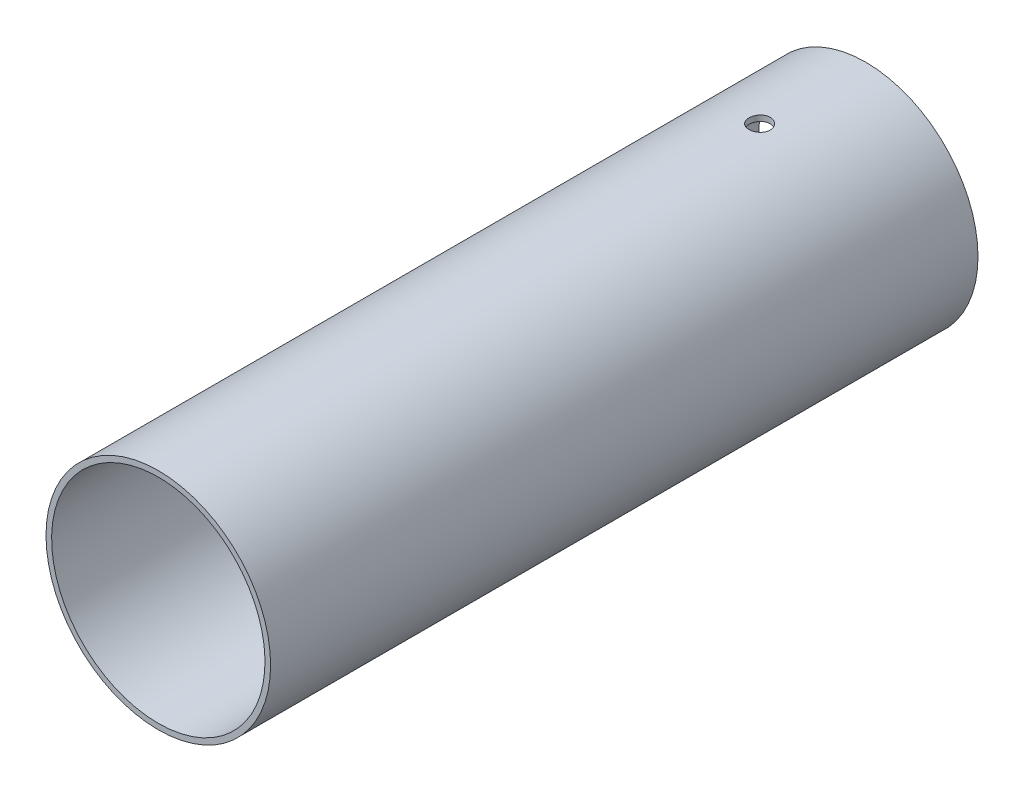
ISO-10303-21;
HEADER;
FILE_DESCRIPTION(('STEP AP214'),'2;1');
FILE_NAME('part.step','',(''),(''),'','','');
FILE_SCHEMA(('AUTOMOTIVE_DESIGN { 1 0 10303 214 1 1 1 1 }'));
ENDSEC;
DATA;
#1=APPLICATION_CONTEXT('core data for automotive mechanical design processes');
#2=APPLICATION_PROTOCOL_DEFINITION('international standard','automotive_design',2000,#1);
#3=PRODUCT_CONTEXT('',#1,'mechanical');
#4=PRODUCT('Part','Part','',(#3));
#5=PRODUCT_RELATED_PRODUCT_CATEGORY('part','',(#4));
#6=PRODUCT_DEFINITION_FORMATION('','',#4);
#7=PRODUCT_DEFINITION_CONTEXT('part definition',#1,'design');
#8=PRODUCT_DEFINITION('design','',#6,#7);
#9=PRODUCT_DEFINITION_SHAPE('','',#8);
#10=(LENGTH_UNIT() NAMED_UNIT(*) SI_UNIT(.MILLI.,.METRE.));
#11=(NAMED_UNIT(*) PLANE_ANGLE_UNIT() SI_UNIT($,.RADIAN.));
#12=(NAMED_UNIT(*) SI_UNIT($,.STERADIAN.) SOLID_ANGLE_UNIT());
#13=UNCERTAINTY_MEASURE_WITH_UNIT(LENGTH_MEASURE(1.E-05),#10,'distance_accuracy_value','');
#14=(GEOMETRIC_REPRESENTATION_CONTEXT(3) GLOBAL_UNCERTAINTY_ASSIGNED_CONTEXT((#13)) GLOBAL_UNIT_ASSIGNED_CONTEXT((#10,
#11,#12)) REPRESENTATION_CONTEXT('',''));
#15=CARTESIAN_POINT('',(0.,0.,0.));
#16=DIRECTION('',(0.,0.,1.));
#17=DIRECTION('',(1.,0.,0.));
#18=AXIS2_PLACEMENT_3D('',#15,#16,#17);
#19=CARTESIAN_POINT('',(0.,0.,0.));
#20=DIRECTION('',(0.,0.,1.));
#21=DIRECTION('',(0.,-1.,0.));
#22=AXIS2_PLACEMENT_3D('',#19,#20,#21);
#23=CYLINDRICAL_SURFACE('',#22,63.5);
#24=CARTESIAN_POINT('',(0.,63.5,-346.));
#25=CARTESIAN_POINT('',(0.16816877938534,63.5000004126939,-346.000001603211));
#26=CARTESIAN_POINT('',(0.3363129018746,63.4993305953231,-345.992927121788));
#27=CARTESIAN_POINT('',(0.671456509395669,63.4966709197132,-345.964681368669));
#28=CARTESIAN_POINT('',(0.838455707132574,63.4946807415839,-345.943506680843));
#29=CARTESIAN_POINT('',(1.17019658857256,63.4894336822889,-345.887187127174));
#30=CARTESIAN_POINT('',(1.3349363384223,63.4861757785493,-345.852030983092));
#31=CARTESIAN_POINT('',(1.6609129538474,63.4784842139934,-345.767989973041));
#32=CARTESIAN_POINT('',(1.82214851437531,63.4740501229874,-345.719100083575));
#33=CARTESIAN_POINT('',(2.13975680891662,63.4641368273001,-345.608004852568));
#34=CARTESIAN_POINT('',(2.29613407222356,63.4586586322303,-345.545812367117));
#35=CARTESIAN_POINT('',(2.60314271096063,63.4468065259248,-345.408505822782));
#36=CARTESIAN_POINT('',(2.75377194578975,63.4404322850563,-345.333387006334));
#37=CARTESIAN_POINT('',(3.04808004931412,63.4269729592952,-345.170827073554));
#38=CARTESIAN_POINT('',(3.19176287983415,63.4198882868525,-345.083393095151));
#39=CARTESIAN_POINT('',(3.4713178437417,63.4052013258802,-344.896754963624));
#40=CARTESIAN_POINT('',(3.60718706492454,63.3975988466357,-344.797546463696));
#41=CARTESIAN_POINT('',(3.87043717522845,63.3820727724827,-344.587821717664));
#42=CARTESIAN_POINT('',(3.99779596969299,63.3741484215397,-344.477277793185));
#43=CARTESIAN_POINT('',(4.24280286662339,63.3582173372738,-344.245825486201));
#44=CARTESIAN_POINT('',(4.36044736266011,63.3502105745851,-344.124913288136));
#45=CARTESIAN_POINT('',(4.58510909129194,63.334346573671,-343.873650316176));
#46=CARTESIAN_POINT('',(4.69212974263992,63.3264892880062,-343.743302602132));
#47=CARTESIAN_POINT('',(4.89486908416142,63.3111411916476,-343.473999767805));
#48=CARTESIAN_POINT('',(4.99058358905657,63.3036505172622,-343.335041488925));
#49=CARTESIAN_POINT('',(5.17012218566508,63.2892405082324,-343.049318950477));
#50=CARTESIAN_POINT('',(5.25392793478788,63.2823220616731,-342.902543117761));
#51=CARTESIAN_POINT('',(5.40890339727819,63.2692643684776,-342.602366326684));
#52=CARTESIAN_POINT('',(5.48006842034212,63.2631254113086,-342.448962935324));
#53=CARTESIAN_POINT('',(5.60918567408223,63.2518082675253,-342.136715165658));
#54=CARTESIAN_POINT('',(5.66714300978827,63.2466297098424,-341.977872916976));
#55=CARTESIAN_POINT('',(5.76947580896158,63.2373761959171,-341.655823552431));
#56=CARTESIAN_POINT('',(5.81384626935816,63.2333016462648,-341.492614852715));
#57=CARTESIAN_POINT('',(5.92575833607297,63.2229492885869,-340.9992862261));
#58=CARTESIAN_POINT('',(5.97263291540728,63.2184945076254,-340.664172602972));
#59=CARTESIAN_POINT('',(6.0094688508252,63.2150027843618,-339.990989404346));
#60=CARTESIAN_POINT('',(5.99943155252146,63.2159657139645,-339.652919898925));
#61=CARTESIAN_POINT('',(5.92294109958071,63.2231778709504,-338.984350498691));
#62=CARTESIAN_POINT('',(5.85667041985713,63.2294099997729,-338.653829667068));
#63=CARTESIAN_POINT('',(5.66985832289782,63.2464340784901,-338.008636041995));
#64=CARTESIAN_POINT('',(5.54931624344951,63.2572260840238,-337.693963441976));
#65=CARTESIAN_POINT('',(5.25718591161587,63.2821729618367,-337.088804395211));
#66=CARTESIAN_POINT('',(5.08551636144824,63.29633318264,-336.798357418302));
#67=CARTESIAN_POINT('',(4.69606121832889,63.3264165116538,-336.250330471652));
#68=CARTESIAN_POINT('',(4.47827442125954,63.342339665889,-335.992751360369));
#69=CARTESIAN_POINT('',(4.00174637937747,63.3742308646919,-335.516709850361));
#70=CARTESIAN_POINT('',(3.74284744420715,63.3901988395361,-335.298405266664));
#71=CARTESIAN_POINT('',(3.19199267919488,63.4203211992771,-334.908332127705));
#72=CARTESIAN_POINT('',(2.9000368180469,63.4344755824563,-334.736563616516));
#73=CARTESIAN_POINT('',(2.29124881114212,63.4593798774746,-334.444445972292));
#74=CARTESIAN_POINT('',(1.97441297252129,63.4701292827262,-334.324104489566));
#75=CARTESIAN_POINT('',(1.32490879350666,63.487007089763,-334.138370824237));
#76=CARTESIAN_POINT('',(0.992240875954015,63.4931356148885,-334.072977174964));
#77=CARTESIAN_POINT('',(0.321882883283421,63.5000653077647,-333.999194841242));
#78=CARTESIAN_POINT('',(-0.0157830130025458,63.5008868340858,-333.990588308812));
#79=CARTESIAN_POINT('',(-0.687752568814015,63.4971644804344,-334.030052873406));
#80=CARTESIAN_POINT('',(-1.02205626876792,63.4926206650548,-334.078123288099));
#81=CARTESIAN_POINT('',(-1.67718567829447,63.4786914216867,-334.229396509811));
#82=CARTESIAN_POINT('',(-1.9980350634415,63.4693149207791,-334.332497674846));
#83=CARTESIAN_POINT('',(-2.61788313692959,63.4467727087861,-334.590801590381));
#84=CARTESIAN_POINT('',(-2.91688138528954,63.4336069214284,-334.746005389636));
#85=CARTESIAN_POINT('',(-3.4855269749764,63.4049091871607,-335.104651369947));
#86=CARTESIAN_POINT('',(-3.75508342241363,63.389370249236,-335.30823709742));
#87=CARTESIAN_POINT('',(-4.25627439222475,63.3576934092042,-335.757662725958));
#88=CARTESIAN_POINT('',(-4.48790806598098,63.3415554937034,-336.003503572336));
#89=CARTESIAN_POINT('',(-4.90743191672865,63.3104385209709,-336.531405148936));
#90=CARTESIAN_POINT('',(-5.09517940473717,63.2954633467674,-336.813579524182));
#91=CARTESIAN_POINT('',(-5.42061968118008,63.2684255382998,-337.405592716286));
#92=CARTESIAN_POINT('',(-5.5583130901715,63.256362867928,-337.715431190112));
#93=CARTESIAN_POINT('',(-5.77950266876418,63.2365378563916,-338.353419629339));
#94=CARTESIAN_POINT('',(-5.86308458759428,63.2287687142465,-338.681539723546));
#95=CARTESIAN_POINT('',(-5.97393327743224,63.2183941968479,-339.347417894363));
#96=CARTESIAN_POINT('',(-6.00120147539335,63.2157886907513,-339.685175726539));
#97=CARTESIAN_POINT('',(-5.99933789125506,63.2159613315692,-340.190644544932));
#98=CARTESIAN_POINT('',(-5.9916306722798,63.2166950591828,-340.35869886318));
#99=CARTESIAN_POINT('',(-5.96214662336013,63.2194833405739,-340.693540845157));
#100=CARTESIAN_POINT('',(-5.94037501273101,63.2215374043714,-340.860328955556));
#101=CARTESIAN_POINT('',(-5.88290388443798,63.2269108908934,-341.191518050221));
#102=CARTESIAN_POINT('',(-5.84719925515438,63.2302307780014,-341.355918135404));
#103=CARTESIAN_POINT('',(-5.76214061422804,63.2380388701594,-341.681058618635));
#104=CARTESIAN_POINT('',(-5.71279159913214,63.242526647495,-341.841800333094));
#105=CARTESIAN_POINT('',(-5.60077982424999,63.2525448045042,-342.158587354456));
#106=CARTESIAN_POINT('',(-5.53811368200472,63.2580754490187,-342.31463145668));
#107=CARTESIAN_POINT('',(-5.39995025688859,63.270019286002,-342.620827718784));
#108=CARTESIAN_POINT('',(-5.3244576679958,63.2764321554481,-342.770982009448));
#109=CARTESIAN_POINT('',(-5.16113388655246,63.2899629497557,-343.064458826923));
#110=CARTESIAN_POINT('',(-5.07329836375277,63.2970811217978,-343.207778932373));
#111=CARTESIAN_POINT('',(-4.88596429987072,63.3118170141674,-343.486478845793));
#112=CARTESIAN_POINT('',(-4.78647000669393,63.3194345521066,-343.621861518982));
#113=CARTESIAN_POINT('',(-4.57605536691765,63.3349894479471,-343.884343854705));
#114=CARTESIAN_POINT('',(-4.46508931503468,63.3429280019251,-344.011406810493));
#115=CARTESIAN_POINT('',(-4.23290086227372,63.3588674347698,-344.255694669415));
#116=CARTESIAN_POINT('',(-4.11168222346607,63.3668682898058,-344.372923150016));
#117=CARTESIAN_POINT('',(-3.85972818441674,63.3827140216052,-344.596838057474));
#118=CARTESIAN_POINT('',(-3.728987031406,63.3905588003748,-344.703518018441));
#119=CARTESIAN_POINT('',(-3.45902221687687,63.4058627700035,-344.905463355791));
#120=CARTESIAN_POINT('',(-3.31980170489012,63.4133221021509,-345.000732931857));
#121=CARTESIAN_POINT('',(-3.03343172108278,63.4276666402736,-345.179464769208));
#122=CARTESIAN_POINT('',(-2.88626213823651,63.4345502658618,-345.262894940277));
#123=CARTESIAN_POINT('',(-2.585433638415,63.4475231146313,-345.417018230287));
#124=CARTESIAN_POINT('',(-2.43177712249504,63.4536126283888,-345.487716011811));
#125=CARTESIAN_POINT('',(-2.11914115103201,63.4648223724199,-345.615848411077));
#126=CARTESIAN_POINT('',(-1.96016621953473,63.4699434030297,-345.6732939889));
#127=CARTESIAN_POINT('',(-1.63796115174903,63.4790758110425,-345.774565174168));
#128=CARTESIAN_POINT('',(-1.47473207934228,63.4830874630213,-345.818394152111));
#129=CARTESIAN_POINT('',(-1.09518205821057,63.4909177597106,-345.903301323296));
#130=CARTESIAN_POINT('',(-0.877749559955827,63.4943102252457,-345.939528923201));
#131=CARTESIAN_POINT('',(-0.440197292087434,63.4988510713265,-345.98787716929));
#132=CARTESIAN_POINT('',(-0.220077532113596,63.4999994599198,-345.999997901925));
#133=CARTESIAN_POINT('',(0.,63.5,-346.));
#134=B_SPLINE_CURVE_WITH_KNOTS('',3,(#24,#25,#26,#27,#28,#29,#30,#31,#32,#33,#34,#35,#36,#37,
#38,#39,#40,#41,#42,#43,#44,#45,#46,#47,#48,#49,#50,#51,#52,#53,#54,#55,#56,#57,#58,#59,#60,#61,
#62,#63,#64,#65,#66,#67,#68,#69,#70,#71,#72,#73,#74,#75,#76,#77,#78,#79,#80,#81,#82,#83,#84,#85,
#86,#87,#88,#89,#90,#91,#92,#93,#94,#95,#96,#97,#98,#99,#100,#101,#102,#103,#104,#105,#106,#107,
#108,#109,#110,#111,#112,#113,#114,#115,#116,#117,#118,#119,#120,#121,#122,#123,#124,#125,#126,
#127,#128,#129,#130,#131,#132,#133),.UNSPECIFIED.,.T.,.F.,(4,2,2,2,2,2,2,2,2,2,2,2,2,2,2,2,2,2,
2,2,2,2,2,2,2,2,2,2,2,2,2,2,2,2,2,2,2,2,2,2,2,2,2,2,2,2,2,2,2,2,2,2,2,2,4),(0.,0.50431390906249,
1.00875004531315,1.51359391649456,2.01862268925859,2.52316557232599,3.02789455217056,
3.53233218330064,4.03695662051942,4.54284397526403,5.04891830389315,5.55482924627213,
6.06092688235292,6.56779578201082,7.07485236276459,7.58171262254062,8.08875929874118,
9.09871364456571,10.1086441113382,11.1153098745687,12.1219879213371,13.130275311553,
14.1385890313189,15.150868072441,16.1631480722339,17.175578606889,18.1879821168355,
19.1964995528303,20.2050048474726,21.2116538426255,22.2183231014642,23.2280172221321,
24.2377339341636,25.2506892825623,26.2636320721846,27.2749657200286,28.286273741018,
28.7904808884829,29.29450103138,29.7987062587274,30.3027270911188,30.8068760946836,
31.3108409952607,31.8149831444009,32.3189421757606,32.8249926704866,33.3308582746991,
33.8370320600787,34.3430189679643,34.8503521572878,35.3574991824358,35.8642252617393,
36.3708258117245,37.0308089485878,37.6907897186374),.UNSPECIFIED.);
#135=CARTESIAN_POINT('',(0.,63.5,-346.));
#136=VERTEX_POINT('',#135);
#137=EDGE_CURVE('E67',#136,#136,#134,.T.);
#138=ORIENTED_EDGE('',*,*,#137,.T.);
#139=EDGE_LOOP('',(#138));
#140=FACE_BOUND('',#139,.T.);
#141=CARTESIAN_POINT('',(0.,0.,0.));
#142=DIRECTION('',(0.,0.,1.));
#143=DIRECTION('',(0.,-1.,0.));
#144=AXIS2_PLACEMENT_3D('',#141,#142,#143);
#145=CIRCLE('',#144,63.5);
#146=CARTESIAN_POINT('',(0.,-63.5,0.));
#147=VERTEX_POINT('',#146);
#148=EDGE_CURVE('E10',#147,#147,#145,.T.);
#149=ORIENTED_EDGE('',*,*,#148,.F.);
#150=EDGE_LOOP('',(#149));
#151=FACE_BOUND('',#150,.T.);
#152=CARTESIAN_POINT('',(0.,0.,-400.));
#153=DIRECTION('',(0.,0.,1.));
#154=DIRECTION('',(0.,-1.,0.));
#155=AXIS2_PLACEMENT_3D('',#152,#153,#154);
#156=CIRCLE('',#155,63.5);
#157=CARTESIAN_POINT('',(0.,-63.4999999999999,-400.));
#158=VERTEX_POINT('',#157);
#159=EDGE_CURVE('E63',#158,#158,#156,.T.);
#160=ORIENTED_EDGE('',*,*,#159,.T.);
#161=EDGE_LOOP('',(#160));
#162=FACE_BOUND('',#161,.T.);
#163=ADVANCED_FACE('F43',(#140,#151,#162),#23,.T.);
#164=CARTESIAN_POINT('',(0.,0.,0.));
#165=DIRECTION('',(0.,0.,-1.));
#166=DIRECTION('',(0.,1.,0.));
#167=AXIS2_PLACEMENT_3D('',#164,#165,#166);
#168=PLANE('',#167);
#169=CARTESIAN_POINT('',(0.,0.,0.));
#170=DIRECTION('',(0.,0.,1.));
#171=DIRECTION('',(0.,-1.,0.));
#172=AXIS2_PLACEMENT_3D('',#169,#170,#171);
#173=CIRCLE('',#172,60.325);
#174=CARTESIAN_POINT('',(0.,-60.325,0.));
#175=VERTEX_POINT('',#174);
#176=EDGE_CURVE('E57',#175,#175,#173,.T.);
#177=ORIENTED_EDGE('',*,*,#176,.F.);
#178=EDGE_LOOP('',(#177));
#179=FACE_BOUND('',#178,.T.);
#180=ORIENTED_EDGE('',*,*,#148,.T.);
#181=EDGE_LOOP('',(#180));
#182=FACE_BOUND('',#181,.T.);
#183=ADVANCED_FACE('F83',(#179,#182),#168,.F.);
#184=CARTESIAN_POINT('',(0.,0.,0.));
#185=DIRECTION('',(0.,0.,1.));
#186=DIRECTION('',(0.,-1.,0.));
#187=AXIS2_PLACEMENT_3D('',#184,#185,#186);
#188=CYLINDRICAL_SURFACE('',#187,60.325);
#189=CARTESIAN_POINT('',(0.,60.325,-346.));
#190=CARTESIAN_POINT('',(-0.168125385819185,60.3250004455944,-346.000001648256));
#191=CARTESIAN_POINT('',(-0.336225593780459,60.3242957331419,-345.992930795274));
#192=CARTESIAN_POINT('',(-0.671281065244188,60.3214975226746,-345.964699836638));
#193=CARTESIAN_POINT('',(-0.838236044140614,60.3194036912369,-345.943536348398));
#194=CARTESIAN_POINT('',(-1.16988668530052,60.313883353274,-345.887247358832));
#195=CARTESIAN_POINT('',(-1.33458043513941,60.310455782938,-345.852110711805));
#196=CARTESIAN_POINT('',(-1.66046529890175,60.302363606441,-345.768117386385));
#197=CARTESIAN_POINT('',(-1.82165510767776,60.2976985476022,-345.719255686931));
#198=CARTESIAN_POINT('',(-2.1391710260711,60.2872688254313,-345.608226661939));
#199=CARTESIAN_POINT('',(-2.29550172244595,60.2815052381322,-345.546072349597));
#200=CARTESIAN_POINT('',(-2.60241972383354,60.2690354720282,-345.408851908922));
#201=CARTESIAN_POINT('',(-2.75300488907306,60.2623289463238,-345.333781026401));
#202=CARTESIAN_POINT('',(-3.04722974412363,60.2481676015178,-345.171326217646));
#203=CARTESIAN_POINT('',(-3.19087336391641,60.2407132133529,-345.083949370821));
#204=CARTESIAN_POINT('',(-3.47035602889392,60.2252592559834,-344.897434450088));
#205=CARTESIAN_POINT('',(-3.60619216309033,60.2172594858346,-344.79829203112));
#206=CARTESIAN_POINT('',(-3.86942313944435,60.2009188594896,-344.588676386276));
#207=CARTESIAN_POINT('',(-3.99679329187233,60.1925771113198,-344.478172224116));
#208=CARTESIAN_POINT('',(-4.24182697754423,60.1758059303375,-344.246799756373));
#209=CARTESIAN_POINT('',(-4.35948690551638,60.1673764662538,-344.125927634976));
#210=CARTESIAN_POINT('',(-4.58418452759736,60.1506738895216,-343.874743668081));
#211=CARTESIAN_POINT('',(-4.6912256301089,60.1424007273984,-343.744434874926));
#212=CARTESIAN_POINT('',(-4.8940112482631,60.1262391335059,-343.475207359264));
#213=CARTESIAN_POINT('',(-4.98975158080531,60.1183508448315,-343.336285477373));
#214=CARTESIAN_POINT('',(-5.16936617957922,60.1031731280889,-343.050601589893));
#215=CARTESIAN_POINT('',(-5.25321957071237,60.0958847627519,-342.903826400314));
#216=CARTESIAN_POINT('',(-5.40828974681964,60.0821278646675,-342.603642989507));
#217=CARTESIAN_POINT('',(-5.47950183977342,60.0756596365805,-342.450232331585));
#218=CARTESIAN_POINT('',(-5.60871131265698,60.0637345237772,-342.137962204716));
#219=CARTESIAN_POINT('',(-5.66671382178117,60.0582772466695,-341.979104878339));
#220=CARTESIAN_POINT('',(-5.76913386801196,60.0485247571699,-341.65701773415));
#221=CARTESIAN_POINT('',(-5.81354640305241,60.0442299727242,-341.493786330355));
#222=CARTESIAN_POINT('',(-5.92555358764156,60.0333189301441,-341.000485757692));
#223=CARTESIAN_POINT('',(-5.97249255784458,60.0286211062339,-340.665416905114));
#224=CARTESIAN_POINT('',(-6.00946874695258,60.0249298762934,-339.992308935768));
#225=CARTESIAN_POINT('',(-5.99950744639967,60.0259363218382,-339.654269896512));
#226=CARTESIAN_POINT('',(-5.92319311363725,60.0335144162036,-338.985872280645));
#227=CARTESIAN_POINT('',(-5.85704245443654,60.0400660928782,-338.655490506623));
#228=CARTESIAN_POINT('',(-5.67052219361826,60.0579678354607,-338.010554891746));
#229=CARTESIAN_POINT('',(-5.55015186665807,60.0693179655615,-337.6960012627));
#230=CARTESIAN_POINT('',(-5.25839089406414,60.0955600274737,-337.090995407108));
#231=CARTESIAN_POINT('',(-5.08691040372326,60.1104581868915,-336.800586783573));
#232=CARTESIAN_POINT('',(-4.69785995511456,60.1421125511828,-336.252596029732));
#233=CARTESIAN_POINT('',(-4.48028866245947,60.1588688098439,-335.995014850167));
#234=CARTESIAN_POINT('',(-4.00410225612482,60.1924403256945,-335.518813289466));
#235=CARTESIAN_POINT('',(-3.74531231353061,60.2092555215571,-335.30036768845));
#236=CARTESIAN_POINT('',(-3.19464178178336,60.2409812453571,-334.909993035512));
#237=CARTESIAN_POINT('',(-2.90276115613284,60.2558917711938,-334.738064034896));
#238=CARTESIAN_POINT('',(-2.29407387477251,60.282132958046,-334.445610079512));
#239=CARTESIAN_POINT('',(-1.97726294914116,60.293463004143,-334.325093953249));
#240=CARTESIAN_POINT('',(-1.32776508520192,60.3112603267097,-334.139014677088));
#241=CARTESIAN_POINT('',(-0.995078616851338,60.3177277470309,-334.073449901554));
#242=CARTESIAN_POINT('',(-0.324787080724393,60.3250526286086,-333.999356103945));
#243=CARTESIAN_POINT('',(0.0127910771593782,60.3259338130038,-333.990585888274));
#244=CARTESIAN_POINT('',(0.684612480749114,60.3220505393168,-334.029696741208));
#245=CARTESIAN_POINT('',(1.01885577095687,60.3172861566732,-334.077577052823));
#246=CARTESIAN_POINT('',(1.67382364161837,60.3026623500076,-334.228429701421));
#247=CARTESIAN_POINT('',(1.99457447631866,60.2928133679211,-334.331289146317));
#248=CARTESIAN_POINT('',(2.61426848117962,60.2691253466719,-334.5890643524));
#249=CARTESIAN_POINT('',(2.91321116720912,60.2552862189634,-334.743981268813));
#250=CARTESIAN_POINT('',(3.48189378001661,60.2251069343839,-335.102072012712));
#251=CARTESIAN_POINT('',(3.75153345409339,60.2087586262908,-335.305404352363));
#252=CARTESIAN_POINT('',(4.25294113196617,60.1754217574758,-335.75432794464));
#253=CARTESIAN_POINT('',(4.48470819531648,60.1584331808679,-335.999920246349));
#254=CARTESIAN_POINT('',(4.90462918743742,60.1256590549406,-336.52743999429));
#255=CARTESIAN_POINT('',(5.09262485401664,60.1098780055217,-336.809493728558));
#256=CARTESIAN_POINT('',(5.4185769553781,60.0813743244561,-337.401323555115));
#257=CARTESIAN_POINT('',(5.55653406806915,60.0686516513762,-337.711099271764));
#258=CARTESIAN_POINT('',(5.77823423773356,60.0477316078443,-338.348973374125));
#259=CARTESIAN_POINT('',(5.86207154838321,60.0395263736232,-338.677038818143));
#260=CARTESIAN_POINT('',(5.97343439389181,60.0285513960122,-339.342860401482));
#261=CARTESIAN_POINT('',(6.00096152487116,60.0257814985568,-339.680616265853));
#262=CARTESIAN_POINT('',(5.99948064956228,60.0259250565484,-340.1860413766));
#263=CARTESIAN_POINT('',(5.99190608912614,60.026684523134,-340.354038140963));
#264=CARTESIAN_POINT('',(5.96269715751859,60.0295937849335,-340.688775961811));
#265=CARTESIAN_POINT('',(5.94106800502368,60.0317430640883,-340.855517461156));
#266=CARTESIAN_POINT('',(5.88389104339375,60.0373738797223,-341.186624433669));
#267=CARTESIAN_POINT('',(5.8483381324462,60.040855904523,-341.350989012992));
#268=CARTESIAN_POINT('',(5.76359159337782,60.0490503659262,-341.676070294309));
#269=CARTESIAN_POINT('',(5.71440295392417,60.0537623525073,-341.836788307189));
#270=CARTESIAN_POINT('',(5.60272176790454,60.0642845348322,-342.153535994515));
#271=CARTESIAN_POINT('',(5.54022622256896,60.0700949780849,-342.309564603124));
#272=CARTESIAN_POINT('',(5.40241208214478,60.0826460099503,-342.615744213202));
#273=CARTESIAN_POINT('',(5.32709817277908,60.0893862585048,-342.765897337859));
#274=CARTESIAN_POINT('',(5.16413863513174,60.1036104193964,-343.059388083817));
#275=CARTESIAN_POINT('',(5.07648865111544,60.1110945941303,-343.202723273756));
#276=CARTESIAN_POINT('',(4.88953086151849,60.1265906592044,-343.481471148712));
#277=CARTESIAN_POINT('',(4.79022729442303,60.1346023572184,-343.616886687473));
#278=CARTESIAN_POINT('',(4.58015415634071,60.1509680644264,-343.87950925007));
#279=CARTESIAN_POINT('',(4.46933427923815,60.1593234701601,-344.006675950368));
#280=CARTESIAN_POINT('',(4.23743026137756,60.1761025324966,-344.251184016833));
#281=CARTESIAN_POINT('',(4.11634988143214,60.1845261630776,-344.368528951923));
#282=CARTESIAN_POINT('',(3.86466269626721,60.2012119384203,-344.59268961727));
#283=CARTESIAN_POINT('',(3.73405014019085,60.2094739818197,-344.699498898355));
#284=CARTESIAN_POINT('',(3.46433050314591,60.2255948981378,-344.901715405959));
#285=CARTESIAN_POINT('',(3.32522657649783,60.2334539187965,-344.997126828004));
#286=CARTESIAN_POINT('',(3.03904582049591,60.248571865132,-345.176173378281));
#287=CARTESIAN_POINT('',(2.89194724236984,60.2558290026938,-345.259773901482));
#288=CARTESIAN_POINT('',(2.59124231741373,60.2695091310635,-345.414242786461));
#289=CARTESIAN_POINT('',(2.43763837924124,60.2759324270878,-345.485115810629));
#290=CARTESIAN_POINT('',(2.12508734241436,60.2877604251796,-345.613601863693));
#291=CARTESIAN_POINT('',(1.96614474724513,60.2931659615639,-345.671225762314));
#292=CARTESIAN_POINT('',(1.6439852650446,60.3028101789735,-345.772853986259));
#293=CARTESIAN_POINT('',(1.48076943937462,60.3070491467896,-345.816861659344));
#294=CARTESIAN_POINT('',(1.10027019788175,60.3153504752772,-345.902393427459));
#295=CARTESIAN_POINT('',(0.881844133461241,60.3189547059089,-345.938960751192));
#296=CARTESIAN_POINT('',(0.442264189224684,60.3237791704081,-345.987762904104));
#297=CARTESIAN_POINT('',(0.221110320511851,60.3249994139761,-345.999997832294));
#298=CARTESIAN_POINT('',(0.,60.325,-346.));
#299=B_SPLINE_CURVE_WITH_KNOTS('',3,(#189,#190,#191,#192,#193,#194,#195,#196,#197,#198,#199,
#200,#201,#202,#203,#204,#205,#206,#207,#208,#209,#210,#211,#212,#213,#214,#215,#216,#217,#218,
#219,#220,#221,#222,#223,#224,#225,#226,#227,#228,#229,#230,#231,#232,#233,#234,#235,#236,#237,
#238,#239,#240,#241,#242,#243,#244,#245,#246,#247,#248,#249,#250,#251,#252,#253,#254,#255,#256,
#257,#258,#259,#260,#261,#262,#263,#264,#265,#266,#267,#268,#269,#270,#271,#272,#273,#274,#275,
#276,#277,#278,#279,#280,#281,#282,#283,#284,#285,#286,#287,#288,#289,#290,#291,#292,#293,#294,
#295,#296,#297,#298),.UNSPECIFIED.,.T.,.F.,(4,2,2,2,2,2,2,2,2,2,2,2,2,2,2,2,2,2,2,2,2,2,2,2,2,2,
2,2,2,2,2,2,2,2,2,2,2,2,2,2,2,2,2,2,2,2,2,2,2,2,2,2,2,2,4),(0.,0.504182802852439,
1.00848666584622,1.51319359666187,2.01808540636097,2.52248518160914,3.0270710094041,
3.53136773441892,4.03585128068021,4.54174678639064,5.0478292868766,5.55374881714336,
6.05985503550019,6.56683931800598,7.07401138417894,7.58098618173424,8.08814735782944,
9.09800260625738,10.1078315784233,11.1140388717503,12.1202596263683,13.1282597181736,
14.1362889968511,15.1487136384903,16.1611393967977,17.1737389366968,18.1863085195912,
19.1945751136851,20.2028282350273,21.2090189560948,22.2152320073555,23.2247858303124,
24.2343647185158,25.247539092872,26.2606997405029,27.2720910985338,28.2834537881289,
28.7874708718564,29.291300913497,29.7953157367788,30.2991464077151,30.8030907394986,
31.3068512497182,31.810790080664,32.3145461904849,32.8206035316947,33.3264761819142,
33.8326565941424,34.3386501046303,34.8460966858822,35.3533569963574,35.860199648159,
36.3669175855825,37.0299969546561,37.6930736256305),.UNSPECIFIED.);
#300=CARTESIAN_POINT('',(0.,60.325,-346.));
#301=VERTEX_POINT('',#300);
#302=EDGE_CURVE('E50',#301,#301,#299,.T.);
#303=ORIENTED_EDGE('',*,*,#302,.T.);
#304=EDGE_LOOP('',(#303));
#305=FACE_BOUND('',#304,.T.);
#306=CARTESIAN_POINT('',(0.,0.,-400.));
#307=DIRECTION('',(0.,0.,1.));
#308=DIRECTION('',(0.,-1.,0.));
#309=AXIS2_PLACEMENT_3D('',#306,#307,#308);
#310=CIRCLE('',#309,60.325);
#311=CARTESIAN_POINT('',(0.,-60.3249999999999,-400.));
#312=VERTEX_POINT('',#311);
#313=EDGE_CURVE('E58',#312,#312,#310,.T.);
#314=ORIENTED_EDGE('',*,*,#313,.F.);
#315=EDGE_LOOP('',(#314));
#316=FACE_BOUND('',#315,.T.);
#317=ORIENTED_EDGE('',*,*,#176,.T.);
#318=EDGE_LOOP('',(#317));
#319=FACE_BOUND('',#318,.T.);
#320=ADVANCED_FACE('F82',(#305,#316,#319),#188,.F.);
#321=CARTESIAN_POINT('',(0.,0.,-400.));
#322=DIRECTION('',(0.,0.,1.));
#323=DIRECTION('',(0.,-1.,0.));
#324=AXIS2_PLACEMENT_3D('',#321,#322,#323);
#325=PLANE('',#324);
#326=ORIENTED_EDGE('',*,*,#159,.F.);
#327=EDGE_LOOP('',(#326));
#328=FACE_BOUND('',#327,.T.);
#329=ORIENTED_EDGE('',*,*,#313,.T.);
#330=EDGE_LOOP('',(#329));
#331=FACE_BOUND('',#330,.T.);
#332=ADVANCED_FACE('F80',(#328,#331),#325,.F.);
#333=CARTESIAN_POINT('',(0.,61.9125,-340.));
#334=DIRECTION('',(0.,-1.,0.));
#335=DIRECTION('',(0.,0.,-1.));
#336=AXIS2_PLACEMENT_3D('',#333,#334,#335);
#337=CYLINDRICAL_SURFACE('',#336,5.99999999999998);
#338=ORIENTED_EDGE('',*,*,#302,.F.);
#339=EDGE_LOOP('',(#338));
#340=FACE_BOUND('',#339,.T.);
#341=ORIENTED_EDGE('',*,*,#137,.F.);
#342=EDGE_LOOP('',(#341));
#343=FACE_BOUND('',#342,.T.);
#344=ADVANCED_FACE('F71',(#340,#343),#337,.F.);
#345=CLOSED_SHELL('',(#163,#183,#320,#332,#344));
#346=MANIFOLD_SOLID_BREP('B2',#345);
#347=ADVANCED_BREP_SHAPE_REPRESENTATION('',(#18,#346),#14);
#348=SHAPE_DEFINITION_REPRESENTATION(#9,#347);
ENDSEC;
END-ISO-10303-21;
